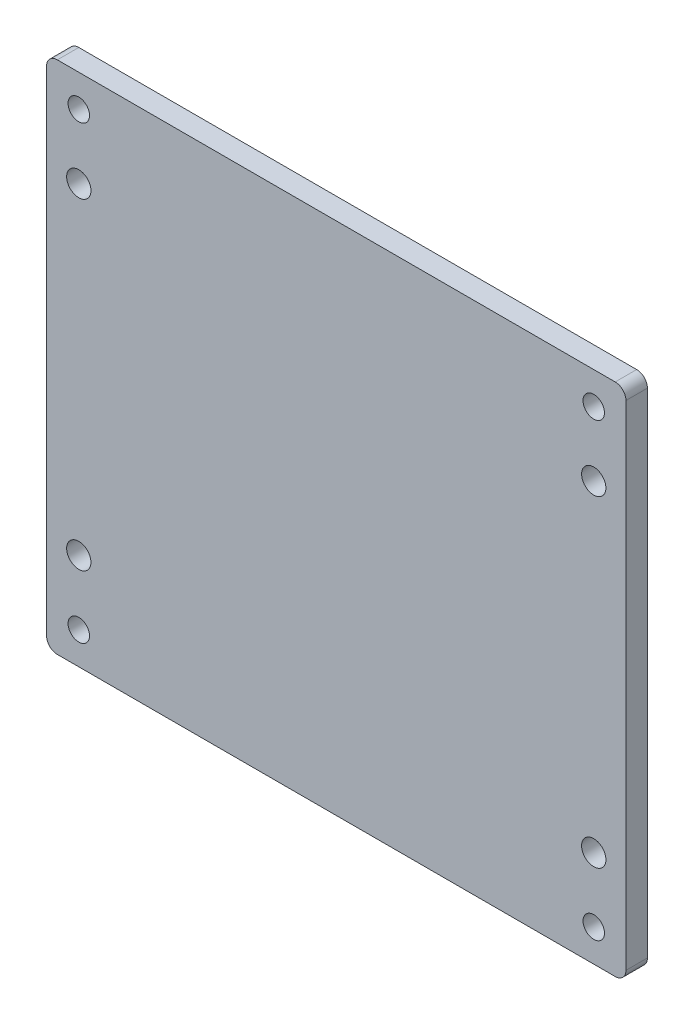
ISO-10303-21;
HEADER;
FILE_DESCRIPTION(('STEP AP214'),'2;1');
FILE_NAME('part.step','',(''),(''),'','','');
FILE_SCHEMA(('AUTOMOTIVE_DESIGN { 1 0 10303 214 1 1 1 1 }'));
ENDSEC;
DATA;
#1=APPLICATION_CONTEXT('core data for automotive mechanical design processes');
#2=APPLICATION_PROTOCOL_DEFINITION('international standard','automotive_design',2000,#1);
#3=PRODUCT_CONTEXT('',#1,'mechanical');
#4=PRODUCT('Part','Part','',(#3));
#5=PRODUCT_RELATED_PRODUCT_CATEGORY('part','',(#4));
#6=PRODUCT_DEFINITION_FORMATION('','',#4);
#7=PRODUCT_DEFINITION_CONTEXT('part definition',#1,'design');
#8=PRODUCT_DEFINITION('design','',#6,#7);
#9=PRODUCT_DEFINITION_SHAPE('','',#8);
#10=(LENGTH_UNIT() NAMED_UNIT(*) SI_UNIT(.MILLI.,.METRE.));
#11=(NAMED_UNIT(*) PLANE_ANGLE_UNIT() SI_UNIT($,.RADIAN.));
#12=(NAMED_UNIT(*) SI_UNIT($,.STERADIAN.) SOLID_ANGLE_UNIT());
#13=UNCERTAINTY_MEASURE_WITH_UNIT(LENGTH_MEASURE(1.E-05),#10,'distance_accuracy_value','');
#14=(GEOMETRIC_REPRESENTATION_CONTEXT(3) GLOBAL_UNCERTAINTY_ASSIGNED_CONTEXT((#13)) GLOBAL_UNIT_ASSIGNED_CONTEXT((#10,
#11,#12)) REPRESENTATION_CONTEXT('',''));
#15=CARTESIAN_POINT('',(0.,0.,0.));
#16=DIRECTION('',(0.,0.,1.));
#17=DIRECTION('',(1.,0.,0.));
#18=AXIS2_PLACEMENT_3D('',#15,#16,#17);
#19=CARTESIAN_POINT('',(7.478092,297.7486817781,3.));
#20=DIRECTION('',(0.,0.,1.));
#21=DIRECTION('',(1.,0.,0.));
#22=AXIS2_PLACEMENT_3D('',#19,#20,#21);
#23=PLANE('',#22);
#24=CARTESIAN_POINT('',(82.48303636,240.7456085396,3.));
#25=DIRECTION('',(0.,0.,1.));
#26=DIRECTION('',(1.,0.,0.));
#27=AXIS2_PLACEMENT_3D('',#24,#25,#26);
#28=CIRCLE('',#27,1.69999999999999);
#29=CARTESIAN_POINT('',(84.18303636,240.7456085396,3.));
#30=VERTEX_POINT('',#29);
#31=EDGE_CURVE('E212',#30,#30,#28,.T.);
#32=ORIENTED_EDGE('',*,*,#31,.F.);
#33=EDGE_LOOP('',(#32));
#34=FACE_BOUND('',#33,.T.);
#35=CARTESIAN_POINT('',(10.478092,240.7456085396,3.));
#36=DIRECTION('',(0.,0.,1.));
#37=DIRECTION('',(1.,0.,0.));
#38=AXIS2_PLACEMENT_3D('',#35,#36,#37);
#39=CIRCLE('',#38,1.7);
#40=CARTESIAN_POINT('',(12.178092,240.7456085396,3.));
#41=VERTEX_POINT('',#40);
#42=EDGE_CURVE('E200',#41,#41,#39,.T.);
#43=ORIENTED_EDGE('',*,*,#42,.F.);
#44=EDGE_LOOP('',(#43));
#45=FACE_BOUND('',#44,.T.);
#46=CARTESIAN_POINT('',(82.48303636,231.7459430417,3.));
#47=DIRECTION('',(0.,0.,1.));
#48=DIRECTION('',(1.,0.,0.));
#49=AXIS2_PLACEMENT_3D('',#46,#47,#48);
#50=CIRCLE('',#49,1.5);
#51=CARTESIAN_POINT('',(83.98303636,231.7459430417,3.));
#52=VERTEX_POINT('',#51);
#53=EDGE_CURVE('E188',#52,#52,#50,.T.);
#54=ORIENTED_EDGE('',*,*,#53,.F.);
#55=EDGE_LOOP('',(#54));
#56=FACE_BOUND('',#55,.T.);
#57=CARTESIAN_POINT('',(82.48303636,294.7486817781,3.));
#58=DIRECTION('',(0.,0.,1.));
#59=DIRECTION('',(1.,0.,0.));
#60=AXIS2_PLACEMENT_3D('',#57,#58,#59);
#61=CIRCLE('',#60,1.5);
#62=CARTESIAN_POINT('',(83.98303636,294.7486817781,3.));
#63=VERTEX_POINT('',#62);
#64=EDGE_CURVE('E134',#63,#63,#61,.T.);
#65=ORIENTED_EDGE('',*,*,#64,.F.);
#66=EDGE_LOOP('',(#65));
#67=FACE_BOUND('',#66,.T.);
#68=CARTESIAN_POINT('',(7.478092,297.7486817781,3.));
#69=DIRECTION('',(0.,0.,1.));
#70=DIRECTION('',(1.,0.,0.));
#71=AXIS2_PLACEMENT_3D('',#68,#69,#70);
#72=CIRCLE('',#71,1.5);
#73=CARTESIAN_POINT('',(7.478092,299.2486817781,3.));
#74=VERTEX_POINT('',#73);
#75=CARTESIAN_POINT('',(5.978092,297.7486817781,3.));
#76=VERTEX_POINT('',#75);
#77=EDGE_CURVE('E145',#74,#76,#72,.T.);
#78=ORIENTED_EDGE('',*,*,#77,.T.);
#79=DIRECTION('',(0.,-1.,0.));
#80=VECTOR('',#79,1.);
#81=CARTESIAN_POINT('',(5.978092,228.7462775439,3.));
#82=LINE('',#81,#80);
#83=CARTESIAN_POINT('',(5.978092,228.7462775439,3.));
#84=VERTEX_POINT('',#83);
#85=EDGE_CURVE('E93',#76,#84,#82,.T.);
#86=ORIENTED_EDGE('',*,*,#85,.T.);
#87=CARTESIAN_POINT('',(7.478092,228.7462775439,3.));
#88=DIRECTION('',(0.,0.,1.));
#89=DIRECTION('',(1.,0.,0.));
#90=AXIS2_PLACEMENT_3D('',#87,#88,#89);
#91=CIRCLE('',#90,1.5);
#92=CARTESIAN_POINT('',(7.478092,227.2462775439,3.));
#93=VERTEX_POINT('',#92);
#94=EDGE_CURVE('E160',#84,#93,#91,.T.);
#95=ORIENTED_EDGE('',*,*,#94,.T.);
#96=DIRECTION('',(1.,0.,0.));
#97=VECTOR('',#96,1.);
#98=CARTESIAN_POINT('',(85.4827018578,227.2462775439,3.));
#99=LINE('',#98,#97);
#100=CARTESIAN_POINT('',(85.4827018578,227.2462775439,3.));
#101=VERTEX_POINT('',#100);
#102=EDGE_CURVE('E173',#93,#101,#99,.T.);
#103=ORIENTED_EDGE('',*,*,#102,.T.);
#104=CARTESIAN_POINT('',(85.4827018578,228.7462775439,3.));
#105=DIRECTION('',(0.,0.,1.));
#106=DIRECTION('',(1.,0.,0.));
#107=AXIS2_PLACEMENT_3D('',#104,#105,#106);
#108=CIRCLE('',#107,1.5);
#109=CARTESIAN_POINT('',(86.9827018578,228.7462775439,3.));
#110=VERTEX_POINT('',#109);
#111=EDGE_CURVE('E112',#101,#110,#108,.T.);
#112=ORIENTED_EDGE('',*,*,#111,.T.);
#113=DIRECTION('',(0.,1.,0.));
#114=VECTOR('',#113,1.);
#115=CARTESIAN_POINT('',(86.9827018578,297.7486817781,3.));
#116=LINE('',#115,#114);
#117=CARTESIAN_POINT('',(86.9827018578,297.7486817781,3.));
#118=VERTEX_POINT('',#117);
#119=EDGE_CURVE('E106',#110,#118,#116,.T.);
#120=ORIENTED_EDGE('',*,*,#119,.T.);
#121=CARTESIAN_POINT('',(85.4827018578,297.7486817781,3.));
#122=DIRECTION('',(0.,0.,1.));
#123=DIRECTION('',(1.,0.,0.));
#124=AXIS2_PLACEMENT_3D('',#121,#122,#123);
#125=CIRCLE('',#124,1.5);
#126=CARTESIAN_POINT('',(85.4827018578,299.2486817781,3.));
#127=VERTEX_POINT('',#126);
#128=EDGE_CURVE('E110',#118,#127,#125,.T.);
#129=ORIENTED_EDGE('',*,*,#128,.T.);
#130=DIRECTION('',(-1.,0.,0.));
#131=VECTOR('',#130,1.);
#132=CARTESIAN_POINT('',(7.478092,299.2486817781,3.));
#133=LINE('',#132,#131);
#134=EDGE_CURVE('E50',#127,#74,#133,.T.);
#135=ORIENTED_EDGE('',*,*,#134,.T.);
#136=EDGE_LOOP('',(#78,#86,#95,#103,#112,#120,#129,#135));
#137=FACE_BOUND('',#136,.T.);
#138=CARTESIAN_POINT('',(10.478092,231.7459430417,3.));
#139=DIRECTION('',(0.,0.,1.));
#140=DIRECTION('',(1.,0.,0.));
#141=AXIS2_PLACEMENT_3D('',#138,#139,#140);
#142=CIRCLE('',#141,1.5);
#143=CARTESIAN_POINT('',(11.978092,231.7459430417,3.));
#144=VERTEX_POINT('',#143);
#145=EDGE_CURVE('E182',#144,#144,#142,.T.);
#146=ORIENTED_EDGE('',*,*,#145,.F.);
#147=EDGE_LOOP('',(#146));
#148=FACE_BOUND('',#147,.T.);
#149=CARTESIAN_POINT('',(10.478092,294.7486817781,3.));
#150=DIRECTION('',(0.,0.,1.));
#151=DIRECTION('',(1.,0.,0.));
#152=AXIS2_PLACEMENT_3D('',#149,#150,#151);
#153=CIRCLE('',#152,1.5);
#154=CARTESIAN_POINT('',(11.978092,294.7486817781,3.));
#155=VERTEX_POINT('',#154);
#156=EDGE_CURVE('E194',#155,#155,#153,.T.);
#157=ORIENTED_EDGE('',*,*,#156,.F.);
#158=EDGE_LOOP('',(#157));
#159=FACE_BOUND('',#158,.T.);
#160=CARTESIAN_POINT('',(10.478092,285.7490162803,3.));
#161=DIRECTION('',(0.,0.,1.));
#162=DIRECTION('',(1.,0.,0.));
#163=AXIS2_PLACEMENT_3D('',#160,#161,#162);
#164=CIRCLE('',#163,1.7);
#165=CARTESIAN_POINT('',(12.178092,285.7490162803,3.));
#166=VERTEX_POINT('',#165);
#167=EDGE_CURVE('E206',#166,#166,#164,.T.);
#168=ORIENTED_EDGE('',*,*,#167,.F.);
#169=EDGE_LOOP('',(#168));
#170=FACE_BOUND('',#169,.T.);
#171=CARTESIAN_POINT('',(82.48303636,285.7490162803,3.));
#172=DIRECTION('',(0.,0.,1.));
#173=DIRECTION('',(1.,0.,0.));
#174=AXIS2_PLACEMENT_3D('',#171,#172,#173);
#175=CIRCLE('',#174,1.69999999999999);
#176=CARTESIAN_POINT('',(84.18303636,285.7490162803,3.));
#177=VERTEX_POINT('',#176);
#178=EDGE_CURVE('E218',#177,#177,#175,.T.);
#179=ORIENTED_EDGE('',*,*,#178,.F.);
#180=EDGE_LOOP('',(#179));
#181=FACE_BOUND('',#180,.T.);
#182=ADVANCED_FACE('F33',(#34,#45,#56,#67,#137,#148,#159,#170,#181),#23,.T.);
#183=CARTESIAN_POINT('',(7.478092,297.7486817781,0.));
#184=DIRECTION('',(0.,0.,1.));
#185=DIRECTION('',(1.,0.,0.));
#186=AXIS2_PLACEMENT_3D('',#183,#184,#185);
#187=PLANE('',#186);
#188=CARTESIAN_POINT('',(82.48303636,240.7456085396,0.));
#189=DIRECTION('',(0.,0.,1.));
#190=DIRECTION('',(1.,0.,0.));
#191=AXIS2_PLACEMENT_3D('',#188,#189,#190);
#192=CIRCLE('',#191,1.69999999999999);
#193=CARTESIAN_POINT('',(84.18303636,240.7456085396,0.));
#194=VERTEX_POINT('',#193);
#195=EDGE_CURVE('E215',#194,#194,#192,.T.);
#196=ORIENTED_EDGE('',*,*,#195,.T.);
#197=EDGE_LOOP('',(#196));
#198=FACE_BOUND('',#197,.T.);
#199=CARTESIAN_POINT('',(10.478092,240.7456085396,0.));
#200=DIRECTION('',(0.,0.,1.));
#201=DIRECTION('',(1.,0.,0.));
#202=AXIS2_PLACEMENT_3D('',#199,#200,#201);
#203=CIRCLE('',#202,1.7);
#204=CARTESIAN_POINT('',(12.178092,240.7456085396,0.));
#205=VERTEX_POINT('',#204);
#206=EDGE_CURVE('E203',#205,#205,#203,.T.);
#207=ORIENTED_EDGE('',*,*,#206,.T.);
#208=EDGE_LOOP('',(#207));
#209=FACE_BOUND('',#208,.T.);
#210=CARTESIAN_POINT('',(82.48303636,231.7459430417,0.));
#211=DIRECTION('',(0.,0.,1.));
#212=DIRECTION('',(1.,0.,0.));
#213=AXIS2_PLACEMENT_3D('',#210,#211,#212);
#214=CIRCLE('',#213,1.5);
#215=CARTESIAN_POINT('',(83.98303636,231.7459430417,0.));
#216=VERTEX_POINT('',#215);
#217=EDGE_CURVE('E191',#216,#216,#214,.T.);
#218=ORIENTED_EDGE('',*,*,#217,.T.);
#219=EDGE_LOOP('',(#218));
#220=FACE_BOUND('',#219,.T.);
#221=CARTESIAN_POINT('',(82.48303636,294.7486817781,0.));
#222=DIRECTION('',(0.,0.,1.));
#223=DIRECTION('',(1.,0.,0.));
#224=AXIS2_PLACEMENT_3D('',#221,#222,#223);
#225=CIRCLE('',#224,1.5);
#226=CARTESIAN_POINT('',(83.98303636,294.7486817781,0.));
#227=VERTEX_POINT('',#226);
#228=EDGE_CURVE('E179',#227,#227,#225,.T.);
#229=ORIENTED_EDGE('',*,*,#228,.T.);
#230=EDGE_LOOP('',(#229));
#231=FACE_BOUND('',#230,.T.);
#232=CARTESIAN_POINT('',(7.478092,297.7486817781,0.));
#233=DIRECTION('',(0.,0.,1.));
#234=DIRECTION('',(1.,0.,0.));
#235=AXIS2_PLACEMENT_3D('',#232,#233,#234);
#236=CIRCLE('',#235,1.5);
#237=CARTESIAN_POINT('',(7.478092,299.2486817781,0.));
#238=VERTEX_POINT('',#237);
#239=CARTESIAN_POINT('',(5.978092,297.7486817781,0.));
#240=VERTEX_POINT('',#239);
#241=EDGE_CURVE('E130',#238,#240,#236,.T.);
#242=ORIENTED_EDGE('',*,*,#241,.F.);
#243=DIRECTION('',(-1.,0.,0.));
#244=VECTOR('',#243,1.);
#245=CARTESIAN_POINT('',(7.478092,299.2486817781,0.));
#246=LINE('',#245,#244);
#247=CARTESIAN_POINT('',(85.4827018578,299.2486817781,0.));
#248=VERTEX_POINT('',#247);
#249=EDGE_CURVE('E85',#248,#238,#246,.T.);
#250=ORIENTED_EDGE('',*,*,#249,.F.);
#251=CARTESIAN_POINT('',(85.4827018578,297.7486817781,0.));
#252=DIRECTION('',(0.,0.,1.));
#253=DIRECTION('',(1.,0.,0.));
#254=AXIS2_PLACEMENT_3D('',#251,#252,#253);
#255=CIRCLE('',#254,1.5);
#256=CARTESIAN_POINT('',(86.9827018578,297.7486817781,0.));
#257=VERTEX_POINT('',#256);
#258=EDGE_CURVE('E79',#257,#248,#255,.T.);
#259=ORIENTED_EDGE('',*,*,#258,.F.);
#260=DIRECTION('',(0.,1.,0.));
#261=VECTOR('',#260,1.);
#262=CARTESIAN_POINT('',(86.9827018578,297.7486817781,0.));
#263=LINE('',#262,#261);
#264=CARTESIAN_POINT('',(86.9827018578,228.7462775439,0.));
#265=VERTEX_POINT('',#264);
#266=EDGE_CURVE('E120',#265,#257,#263,.T.);
#267=ORIENTED_EDGE('',*,*,#266,.F.);
#268=CARTESIAN_POINT('',(85.4827018578,228.7462775439,0.));
#269=DIRECTION('',(0.,0.,1.));
#270=DIRECTION('',(1.,0.,0.));
#271=AXIS2_PLACEMENT_3D('',#268,#269,#270);
#272=CIRCLE('',#271,1.5);
#273=CARTESIAN_POINT('',(85.4827018578,227.2462775439,0.));
#274=VERTEX_POINT('',#273);
#275=EDGE_CURVE('E140',#274,#265,#272,.T.);
#276=ORIENTED_EDGE('',*,*,#275,.F.);
#277=DIRECTION('',(1.,0.,0.));
#278=VECTOR('',#277,1.);
#279=CARTESIAN_POINT('',(85.4827018578,227.2462775439,0.));
#280=LINE('',#279,#278);
#281=CARTESIAN_POINT('',(7.478092,227.2462775439,0.));
#282=VERTEX_POINT('',#281);
#283=EDGE_CURVE('E138',#282,#274,#280,.T.);
#284=ORIENTED_EDGE('',*,*,#283,.F.);
#285=CARTESIAN_POINT('',(7.478092,228.7462775439,0.));
#286=DIRECTION('',(0.,0.,1.));
#287=DIRECTION('',(1.,0.,0.));
#288=AXIS2_PLACEMENT_3D('',#285,#286,#287);
#289=CIRCLE('',#288,1.5);
#290=CARTESIAN_POINT('',(5.978092,228.7462775439,0.));
#291=VERTEX_POINT('',#290);
#292=EDGE_CURVE('E136',#291,#282,#289,.T.);
#293=ORIENTED_EDGE('',*,*,#292,.F.);
#294=DIRECTION('',(0.,-1.,0.));
#295=VECTOR('',#294,1.);
#296=CARTESIAN_POINT('',(5.978092,228.7462775439,0.));
#297=LINE('',#296,#295);
#298=EDGE_CURVE('E133',#240,#291,#297,.T.);
#299=ORIENTED_EDGE('',*,*,#298,.F.);
#300=EDGE_LOOP('',(#242,#250,#259,#267,#276,#284,#293,#299));
#301=FACE_BOUND('',#300,.T.);
#302=CARTESIAN_POINT('',(10.478092,231.7459430417,0.));
#303=DIRECTION('',(0.,0.,1.));
#304=DIRECTION('',(1.,0.,0.));
#305=AXIS2_PLACEMENT_3D('',#302,#303,#304);
#306=CIRCLE('',#305,1.5);
#307=CARTESIAN_POINT('',(11.978092,231.7459430417,0.));
#308=VERTEX_POINT('',#307);
#309=EDGE_CURVE('E185',#308,#308,#306,.T.);
#310=ORIENTED_EDGE('',*,*,#309,.T.);
#311=EDGE_LOOP('',(#310));
#312=FACE_BOUND('',#311,.T.);
#313=CARTESIAN_POINT('',(10.478092,294.7486817781,0.));
#314=DIRECTION('',(0.,0.,1.));
#315=DIRECTION('',(1.,0.,0.));
#316=AXIS2_PLACEMENT_3D('',#313,#314,#315);
#317=CIRCLE('',#316,1.5);
#318=CARTESIAN_POINT('',(11.978092,294.7486817781,0.));
#319=VERTEX_POINT('',#318);
#320=EDGE_CURVE('E197',#319,#319,#317,.T.);
#321=ORIENTED_EDGE('',*,*,#320,.T.);
#322=EDGE_LOOP('',(#321));
#323=FACE_BOUND('',#322,.T.);
#324=CARTESIAN_POINT('',(10.478092,285.7490162803,0.));
#325=DIRECTION('',(0.,0.,1.));
#326=DIRECTION('',(1.,0.,0.));
#327=AXIS2_PLACEMENT_3D('',#324,#325,#326);
#328=CIRCLE('',#327,1.7);
#329=CARTESIAN_POINT('',(12.178092,285.7490162803,0.));
#330=VERTEX_POINT('',#329);
#331=EDGE_CURVE('E209',#330,#330,#328,.T.);
#332=ORIENTED_EDGE('',*,*,#331,.T.);
#333=EDGE_LOOP('',(#332));
#334=FACE_BOUND('',#333,.T.);
#335=CARTESIAN_POINT('',(82.48303636,285.7490162803,0.));
#336=DIRECTION('',(0.,0.,1.));
#337=DIRECTION('',(1.,0.,0.));
#338=AXIS2_PLACEMENT_3D('',#335,#336,#337);
#339=CIRCLE('',#338,1.69999999999999);
#340=CARTESIAN_POINT('',(84.18303636,285.7490162803,0.));
#341=VERTEX_POINT('',#340);
#342=EDGE_CURVE('E221',#341,#341,#339,.T.);
#343=ORIENTED_EDGE('',*,*,#342,.T.);
#344=EDGE_LOOP('',(#343));
#345=FACE_BOUND('',#344,.T.);
#346=ADVANCED_FACE('F164',(#198,#209,#220,#231,#301,#312,#323,#334,#345),#187,.F.);
#347=CARTESIAN_POINT('',(7.478092,297.7486817781,3.));
#348=DIRECTION('',(0.,0.,-1.));
#349=DIRECTION('',(-1.,0.,0.));
#350=AXIS2_PLACEMENT_3D('',#347,#348,#349);
#351=CYLINDRICAL_SURFACE('',#350,1.5);
#352=ORIENTED_EDGE('',*,*,#241,.T.);
#353=DIRECTION('',(0.,0.,-1.));
#354=VECTOR('',#353,1.);
#355=CARTESIAN_POINT('',(5.978092,297.7486817781,3.));
#356=LINE('',#355,#354);
#357=EDGE_CURVE('E11',#76,#240,#356,.T.);
#358=ORIENTED_EDGE('',*,*,#357,.F.);
#359=ORIENTED_EDGE('',*,*,#77,.F.);
#360=DIRECTION('',(0.,0.,-1.));
#361=VECTOR('',#360,1.);
#362=CARTESIAN_POINT('',(7.478092,299.2486817781,3.));
#363=LINE('',#362,#361);
#364=EDGE_CURVE('E126',#74,#238,#363,.T.);
#365=ORIENTED_EDGE('',*,*,#364,.T.);
#366=EDGE_LOOP('',(#352,#358,#359,#365));
#367=FACE_BOUND('',#366,.T.);
#368=ADVANCED_FACE('F35',(#367),#351,.T.);
#369=CARTESIAN_POINT('',(5.978092,228.7462775439,3.));
#370=DIRECTION('',(1.,0.,0.));
#371=DIRECTION('',(0.,0.,-1.));
#372=AXIS2_PLACEMENT_3D('',#369,#370,#371);
#373=PLANE('',#372);
#374=ORIENTED_EDGE('',*,*,#298,.T.);
#375=DIRECTION('',(0.,0.,-1.));
#376=VECTOR('',#375,1.);
#377=CARTESIAN_POINT('',(5.978092,228.7462775439,3.));
#378=LINE('',#377,#376);
#379=EDGE_CURVE('E42',#84,#291,#378,.T.);
#380=ORIENTED_EDGE('',*,*,#379,.F.);
#381=ORIENTED_EDGE('',*,*,#85,.F.);
#382=ORIENTED_EDGE('',*,*,#357,.T.);
#383=EDGE_LOOP('',(#374,#380,#381,#382));
#384=FACE_BOUND('',#383,.T.);
#385=ADVANCED_FACE('F256',(#384),#373,.F.);
#386=CARTESIAN_POINT('',(7.478092,228.7462775439,3.));
#387=DIRECTION('',(0.,0.,-1.));
#388=DIRECTION('',(-1.,0.,0.));
#389=AXIS2_PLACEMENT_3D('',#386,#387,#388);
#390=CYLINDRICAL_SURFACE('',#389,1.5);
#391=ORIENTED_EDGE('',*,*,#292,.T.);
#392=DIRECTION('',(0.,0.,-1.));
#393=VECTOR('',#392,1.);
#394=CARTESIAN_POINT('',(7.478092,227.2462775439,3.));
#395=LINE('',#394,#393);
#396=EDGE_CURVE('E152',#93,#282,#395,.T.);
#397=ORIENTED_EDGE('',*,*,#396,.F.);
#398=ORIENTED_EDGE('',*,*,#94,.F.);
#399=ORIENTED_EDGE('',*,*,#379,.T.);
#400=EDGE_LOOP('',(#391,#397,#398,#399));
#401=FACE_BOUND('',#400,.T.);
#402=ADVANCED_FACE('F158',(#401),#390,.T.);
#403=CARTESIAN_POINT('',(85.4827018578,227.2462775439,3.));
#404=DIRECTION('',(0.,1.,0.));
#405=DIRECTION('',(0.,0.,1.));
#406=AXIS2_PLACEMENT_3D('',#403,#404,#405);
#407=PLANE('',#406);
#408=ORIENTED_EDGE('',*,*,#283,.T.);
#409=DIRECTION('',(0.,0.,-1.));
#410=VECTOR('',#409,1.);
#411=CARTESIAN_POINT('',(85.4827018578,227.2462775439,3.));
#412=LINE('',#411,#410);
#413=EDGE_CURVE('E149',#101,#274,#412,.T.);
#414=ORIENTED_EDGE('',*,*,#413,.F.);
#415=ORIENTED_EDGE('',*,*,#102,.F.);
#416=ORIENTED_EDGE('',*,*,#396,.T.);
#417=EDGE_LOOP('',(#408,#414,#415,#416));
#418=FACE_BOUND('',#417,.T.);
#419=ADVANCED_FACE('F169',(#418),#407,.F.);
#420=CARTESIAN_POINT('',(85.4827018578,228.7462775439,3.));
#421=DIRECTION('',(0.,0.,-1.));
#422=DIRECTION('',(-1.,0.,0.));
#423=AXIS2_PLACEMENT_3D('',#420,#421,#422);
#424=CYLINDRICAL_SURFACE('',#423,1.5);
#425=ORIENTED_EDGE('',*,*,#275,.T.);
#426=DIRECTION('',(0.,0.,-1.));
#427=VECTOR('',#426,1.);
#428=CARTESIAN_POINT('',(86.9827018578,228.7462775439,3.));
#429=LINE('',#428,#427);
#430=EDGE_CURVE('E121',#110,#265,#429,.T.);
#431=ORIENTED_EDGE('',*,*,#430,.F.);
#432=ORIENTED_EDGE('',*,*,#111,.F.);
#433=ORIENTED_EDGE('',*,*,#413,.T.);
#434=EDGE_LOOP('',(#425,#431,#432,#433));
#435=FACE_BOUND('',#434,.T.);
#436=ADVANCED_FACE('F172',(#435),#424,.T.);
#437=CARTESIAN_POINT('',(86.9827018578,297.7486817781,3.));
#438=DIRECTION('',(-1.,0.,0.));
#439=DIRECTION('',(0.,0.,1.));
#440=AXIS2_PLACEMENT_3D('',#437,#438,#439);
#441=PLANE('',#440);
#442=ORIENTED_EDGE('',*,*,#266,.T.);
#443=DIRECTION('',(0.,0.,-1.));
#444=VECTOR('',#443,1.);
#445=CARTESIAN_POINT('',(86.9827018578,297.7486817781,3.));
#446=LINE('',#445,#444);
#447=EDGE_CURVE('E117',#118,#257,#446,.T.);
#448=ORIENTED_EDGE('',*,*,#447,.F.);
#449=ORIENTED_EDGE('',*,*,#119,.F.);
#450=ORIENTED_EDGE('',*,*,#430,.T.);
#451=EDGE_LOOP('',(#442,#448,#449,#450));
#452=FACE_BOUND('',#451,.T.);
#453=ADVANCED_FACE('F118',(#452),#441,.F.);
#454=CARTESIAN_POINT('',(85.4827018578,297.7486817781,3.));
#455=DIRECTION('',(0.,0.,-1.));
#456=DIRECTION('',(-1.,0.,0.));
#457=AXIS2_PLACEMENT_3D('',#454,#455,#456);
#458=CYLINDRICAL_SURFACE('',#457,1.5);
#459=ORIENTED_EDGE('',*,*,#258,.T.);
#460=DIRECTION('',(0.,0.,-1.));
#461=VECTOR('',#460,1.);
#462=CARTESIAN_POINT('',(85.4827018578,299.2486817781,3.));
#463=LINE('',#462,#461);
#464=EDGE_CURVE('E122',#127,#248,#463,.T.);
#465=ORIENTED_EDGE('',*,*,#464,.F.);
#466=ORIENTED_EDGE('',*,*,#128,.F.);
#467=ORIENTED_EDGE('',*,*,#447,.T.);
#468=EDGE_LOOP('',(#459,#465,#466,#467));
#469=FACE_BOUND('',#468,.T.);
#470=ADVANCED_FACE('F124',(#469),#458,.T.);
#471=CARTESIAN_POINT('',(7.478092,299.2486817781,3.));
#472=DIRECTION('',(0.,-1.,0.));
#473=DIRECTION('',(0.,0.,-1.));
#474=AXIS2_PLACEMENT_3D('',#471,#472,#473);
#475=PLANE('',#474);
#476=ORIENTED_EDGE('',*,*,#249,.T.);
#477=ORIENTED_EDGE('',*,*,#364,.F.);
#478=ORIENTED_EDGE('',*,*,#134,.F.);
#479=ORIENTED_EDGE('',*,*,#464,.T.);
#480=EDGE_LOOP('',(#476,#477,#478,#479));
#481=FACE_BOUND('',#480,.T.);
#482=ADVANCED_FACE('F244',(#481),#475,.F.);
#483=CARTESIAN_POINT('',(82.48303636,294.7486817781,3.));
#484=DIRECTION('',(0.,0.,-1.));
#485=DIRECTION('',(-1.,0.,0.));
#486=AXIS2_PLACEMENT_3D('',#483,#484,#485);
#487=CYLINDRICAL_SURFACE('',#486,1.5);
#488=ORIENTED_EDGE('',*,*,#64,.T.);
#489=EDGE_LOOP('',(#488));
#490=FACE_BOUND('',#489,.T.);
#491=ORIENTED_EDGE('',*,*,#228,.F.);
#492=EDGE_LOOP('',(#491));
#493=FACE_BOUND('',#492,.T.);
#494=ADVANCED_FACE('F241',(#490,#493),#487,.F.);
#495=CARTESIAN_POINT('',(10.478092,231.7459430417,3.));
#496=DIRECTION('',(0.,0.,-1.));
#497=DIRECTION('',(-1.,0.,0.));
#498=AXIS2_PLACEMENT_3D('',#495,#496,#497);
#499=CYLINDRICAL_SURFACE('',#498,1.5);
#500=ORIENTED_EDGE('',*,*,#145,.T.);
#501=EDGE_LOOP('',(#500));
#502=FACE_BOUND('',#501,.T.);
#503=ORIENTED_EDGE('',*,*,#309,.F.);
#504=EDGE_LOOP('',(#503));
#505=FACE_BOUND('',#504,.T.);
#506=ADVANCED_FACE('F320',(#502,#505),#499,.F.);
#507=CARTESIAN_POINT('',(82.48303636,231.7459430417,3.));
#508=DIRECTION('',(0.,0.,-1.));
#509=DIRECTION('',(-1.,0.,0.));
#510=AXIS2_PLACEMENT_3D('',#507,#508,#509);
#511=CYLINDRICAL_SURFACE('',#510,1.5);
#512=ORIENTED_EDGE('',*,*,#53,.T.);
#513=EDGE_LOOP('',(#512));
#514=FACE_BOUND('',#513,.T.);
#515=ORIENTED_EDGE('',*,*,#217,.F.);
#516=EDGE_LOOP('',(#515));
#517=FACE_BOUND('',#516,.T.);
#518=ADVANCED_FACE('F328',(#514,#517),#511,.F.);
#519=CARTESIAN_POINT('',(10.478092,294.7486817781,3.));
#520=DIRECTION('',(0.,0.,-1.));
#521=DIRECTION('',(-1.,0.,0.));
#522=AXIS2_PLACEMENT_3D('',#519,#520,#521);
#523=CYLINDRICAL_SURFACE('',#522,1.5);
#524=ORIENTED_EDGE('',*,*,#156,.T.);
#525=EDGE_LOOP('',(#524));
#526=FACE_BOUND('',#525,.T.);
#527=ORIENTED_EDGE('',*,*,#320,.F.);
#528=EDGE_LOOP('',(#527));
#529=FACE_BOUND('',#528,.T.);
#530=ADVANCED_FACE('F336',(#526,#529),#523,.F.);
#531=CARTESIAN_POINT('',(10.478092,240.7456085396,3.));
#532=DIRECTION('',(0.,0.,-1.));
#533=DIRECTION('',(-1.,0.,0.));
#534=AXIS2_PLACEMENT_3D('',#531,#532,#533);
#535=CYLINDRICAL_SURFACE('',#534,1.7);
#536=ORIENTED_EDGE('',*,*,#42,.T.);
#537=EDGE_LOOP('',(#536));
#538=FACE_BOUND('',#537,.T.);
#539=ORIENTED_EDGE('',*,*,#206,.F.);
#540=EDGE_LOOP('',(#539));
#541=FACE_BOUND('',#540,.T.);
#542=ADVANCED_FACE('F345',(#538,#541),#535,.F.);
#543=CARTESIAN_POINT('',(10.478092,285.7490162803,3.));
#544=DIRECTION('',(0.,0.,-1.));
#545=DIRECTION('',(-1.,0.,0.));
#546=AXIS2_PLACEMENT_3D('',#543,#544,#545);
#547=CYLINDRICAL_SURFACE('',#546,1.7);
#548=ORIENTED_EDGE('',*,*,#167,.T.);
#549=EDGE_LOOP('',(#548));
#550=FACE_BOUND('',#549,.T.);
#551=ORIENTED_EDGE('',*,*,#331,.F.);
#552=EDGE_LOOP('',(#551));
#553=FACE_BOUND('',#552,.T.);
#554=ADVANCED_FACE('F354',(#550,#553),#547,.F.);
#555=CARTESIAN_POINT('',(82.48303636,240.7456085396,3.));
#556=DIRECTION('',(0.,0.,-1.));
#557=DIRECTION('',(-1.,0.,0.));
#558=AXIS2_PLACEMENT_3D('',#555,#556,#557);
#559=CYLINDRICAL_SURFACE('',#558,1.69999999999999);
#560=ORIENTED_EDGE('',*,*,#31,.T.);
#561=EDGE_LOOP('',(#560));
#562=FACE_BOUND('',#561,.T.);
#563=ORIENTED_EDGE('',*,*,#195,.F.);
#564=EDGE_LOOP('',(#563));
#565=FACE_BOUND('',#564,.T.);
#566=ADVANCED_FACE('F363',(#562,#565),#559,.F.);
#567=CARTESIAN_POINT('',(82.48303636,285.7490162803,3.));
#568=DIRECTION('',(0.,0.,-1.));
#569=DIRECTION('',(-1.,0.,0.));
#570=AXIS2_PLACEMENT_3D('',#567,#568,#569);
#571=CYLINDRICAL_SURFACE('',#570,1.69999999999999);
#572=ORIENTED_EDGE('',*,*,#178,.T.);
#573=EDGE_LOOP('',(#572));
#574=FACE_BOUND('',#573,.T.);
#575=ORIENTED_EDGE('',*,*,#342,.F.);
#576=EDGE_LOOP('',(#575));
#577=FACE_BOUND('',#576,.T.);
#578=ADVANCED_FACE('F227',(#574,#577),#571,.F.);
#579=CLOSED_SHELL('',(#182,#346,#368,#385,#402,#419,#436,#453,#470,#482,#494,#506,#518,#530,
#542,#554,#566,#578));
#580=MANIFOLD_SOLID_BREP('B2',#579);
#581=ADVANCED_BREP_SHAPE_REPRESENTATION('',(#18,#580),#14);
#582=SHAPE_DEFINITION_REPRESENTATION(#9,#581);
ENDSEC;
END-ISO-10303-21;
